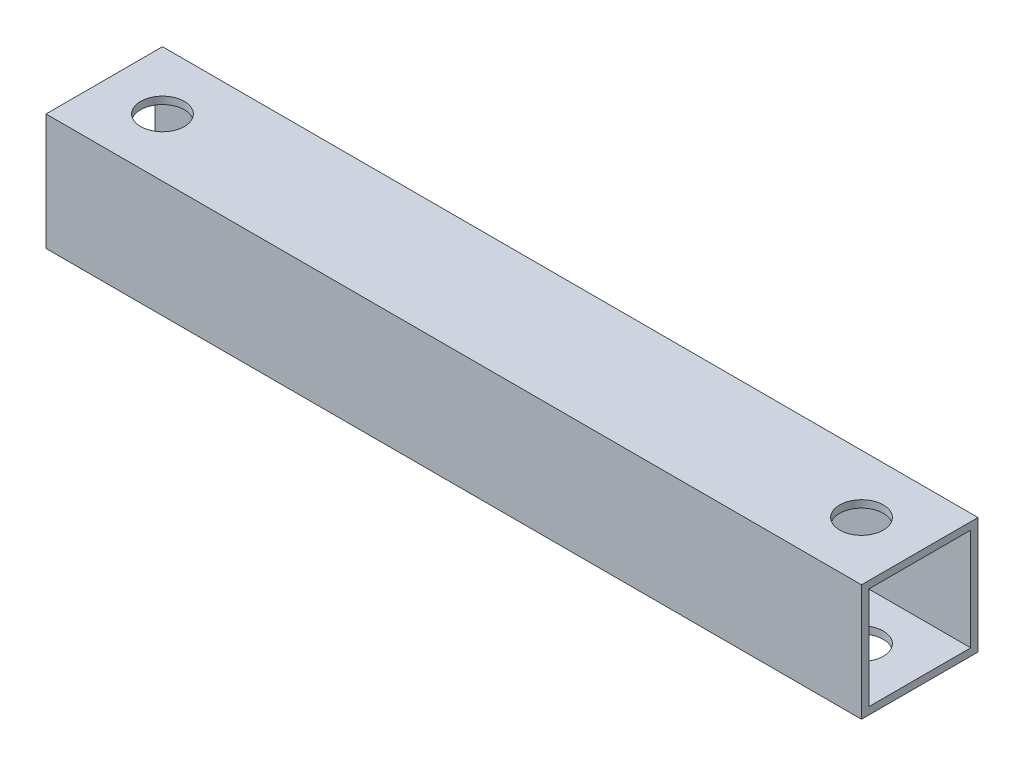
ISO-10303-21;
HEADER;
FILE_DESCRIPTION(('STEP AP214'),'2;1');
FILE_NAME('part.step','',(''),(''),'','','');
FILE_SCHEMA(('AUTOMOTIVE_DESIGN { 1 0 10303 214 1 1 1 1 }'));
ENDSEC;
DATA;
#1=APPLICATION_CONTEXT('core data for automotive mechanical design processes');
#2=APPLICATION_PROTOCOL_DEFINITION('international standard','automotive_design',2000,#1);
#3=PRODUCT_CONTEXT('',#1,'mechanical');
#4=PRODUCT('Part','Part','',(#3));
#5=PRODUCT_RELATED_PRODUCT_CATEGORY('part','',(#4));
#6=PRODUCT_DEFINITION_FORMATION('','',#4);
#7=PRODUCT_DEFINITION_CONTEXT('part definition',#1,'design');
#8=PRODUCT_DEFINITION('design','',#6,#7);
#9=PRODUCT_DEFINITION_SHAPE('','',#8);
#10=(LENGTH_UNIT() NAMED_UNIT(*) SI_UNIT(.MILLI.,.METRE.));
#11=(NAMED_UNIT(*) PLANE_ANGLE_UNIT() SI_UNIT($,.RADIAN.));
#12=(NAMED_UNIT(*) SI_UNIT($,.STERADIAN.) SOLID_ANGLE_UNIT());
#13=UNCERTAINTY_MEASURE_WITH_UNIT(LENGTH_MEASURE(1.E-05),#10,'distance_accuracy_value','');
#14=(GEOMETRIC_REPRESENTATION_CONTEXT(3) GLOBAL_UNCERTAINTY_ASSIGNED_CONTEXT((#13)) GLOBAL_UNIT_ASSIGNED_CONTEXT((#10,
#11,#12)) REPRESENTATION_CONTEXT('',''));
#15=CARTESIAN_POINT('',(0.,0.,0.));
#16=DIRECTION('',(0.,0.,1.));
#17=DIRECTION('',(1.,0.,0.));
#18=AXIS2_PLACEMENT_3D('',#15,#16,#17);
#19=CARTESIAN_POINT('',(177.8,0.,0.));
#20=DIRECTION('',(-1.,0.,0.));
#21=DIRECTION('',(0.,0.,1.));
#22=AXIS2_PLACEMENT_3D('',#19,#20,#21);
#23=PLANE('',#22);
#24=DIRECTION('',(0.,1.,0.));
#25=VECTOR('',#24,1.);
#26=CARTESIAN_POINT('',(177.8,-12.7,-12.7));
#27=LINE('',#26,#25);
#28=CARTESIAN_POINT('',(177.8,-12.7,-12.7));
#29=VERTEX_POINT('',#28);
#30=CARTESIAN_POINT('',(177.8,12.7,-12.7));
#31=VERTEX_POINT('',#30);
#32=EDGE_CURVE('E137',#29,#31,#27,.T.);
#33=ORIENTED_EDGE('',*,*,#32,.T.);
#34=DIRECTION('',(0.,0.,1.));
#35=VECTOR('',#34,1.);
#36=CARTESIAN_POINT('',(177.8,12.7,12.7));
#37=LINE('',#36,#35);
#38=CARTESIAN_POINT('',(177.8,12.7,12.7));
#39=VERTEX_POINT('',#38);
#40=EDGE_CURVE('E140',#31,#39,#37,.T.);
#41=ORIENTED_EDGE('',*,*,#40,.T.);
#42=DIRECTION('',(0.,-1.,0.));
#43=VECTOR('',#42,1.);
#44=CARTESIAN_POINT('',(177.8,-12.7,12.7));
#45=LINE('',#44,#43);
#46=CARTESIAN_POINT('',(177.8,-12.7,12.7));
#47=VERTEX_POINT('',#46);
#48=EDGE_CURVE('E143',#39,#47,#45,.T.);
#49=ORIENTED_EDGE('',*,*,#48,.T.);
#50=DIRECTION('',(0.,0.,-1.));
#51=VECTOR('',#50,1.);
#52=CARTESIAN_POINT('',(177.8,-12.7,12.7));
#53=LINE('',#52,#51);
#54=EDGE_CURVE('E145',#47,#29,#53,.T.);
#55=ORIENTED_EDGE('',*,*,#54,.T.);
#56=EDGE_LOOP('',(#33,#41,#49,#55));
#57=FACE_BOUND('',#56,.T.);
#58=DIRECTION('',(0.,1.,0.));
#59=VECTOR('',#58,1.);
#60=CARTESIAN_POINT('',(177.8,-11.1125,-11.1125));
#61=LINE('',#60,#59);
#62=CARTESIAN_POINT('',(177.8,-11.1125,-11.1125));
#63=VERTEX_POINT('',#62);
#64=CARTESIAN_POINT('',(177.8,11.1125,-11.1125));
#65=VERTEX_POINT('',#64);
#66=EDGE_CURVE('E99',#63,#65,#61,.T.);
#67=ORIENTED_EDGE('',*,*,#66,.F.);
#68=DIRECTION('',(0.,0.,-1.));
#69=VECTOR('',#68,1.);
#70=CARTESIAN_POINT('',(177.8,-11.1125,11.1125));
#71=LINE('',#70,#69);
#72=CARTESIAN_POINT('',(177.8,-11.1125,11.1125));
#73=VERTEX_POINT('',#72);
#74=EDGE_CURVE('E121',#73,#63,#71,.T.);
#75=ORIENTED_EDGE('',*,*,#74,.F.);
#76=DIRECTION('',(0.,-1.,0.));
#77=VECTOR('',#76,1.);
#78=CARTESIAN_POINT('',(177.8,-11.1125,11.1125));
#79=LINE('',#78,#77);
#80=CARTESIAN_POINT('',(177.8,11.1125,11.1125));
#81=VERTEX_POINT('',#80);
#82=EDGE_CURVE('E119',#81,#73,#79,.T.);
#83=ORIENTED_EDGE('',*,*,#82,.F.);
#84=DIRECTION('',(0.,0.,1.));
#85=VECTOR('',#84,1.);
#86=CARTESIAN_POINT('',(177.8,11.1125,11.1125));
#87=LINE('',#86,#85);
#88=EDGE_CURVE('E107',#65,#81,#87,.T.);
#89=ORIENTED_EDGE('',*,*,#88,.F.);
#90=EDGE_LOOP('',(#67,#75,#83,#89));
#91=FACE_BOUND('',#90,.T.);
#92=ADVANCED_FACE('F32',(#57,#91),#23,.F.);
#93=CARTESIAN_POINT('',(0.,0.,0.));
#94=DIRECTION('',(-1.,0.,0.));
#95=DIRECTION('',(0.,0.,1.));
#96=AXIS2_PLACEMENT_3D('',#93,#94,#95);
#97=PLANE('',#96);
#98=DIRECTION('',(0.,1.,0.));
#99=VECTOR('',#98,1.);
#100=CARTESIAN_POINT('',(0.,-12.7,-12.7));
#101=LINE('',#100,#99);
#102=CARTESIAN_POINT('',(0.,-12.7,-12.7));
#103=VERTEX_POINT('',#102);
#104=CARTESIAN_POINT('',(0.,12.7,-12.7));
#105=VERTEX_POINT('',#104);
#106=EDGE_CURVE('E115',#103,#105,#101,.T.);
#107=ORIENTED_EDGE('',*,*,#106,.F.);
#108=DIRECTION('',(0.,0.,-1.));
#109=VECTOR('',#108,1.);
#110=CARTESIAN_POINT('',(0.,-12.7,12.7));
#111=LINE('',#110,#109);
#112=CARTESIAN_POINT('',(0.,-12.7,12.7));
#113=VERTEX_POINT('',#112);
#114=EDGE_CURVE('E141',#113,#103,#111,.T.);
#115=ORIENTED_EDGE('',*,*,#114,.F.);
#116=DIRECTION('',(0.,-1.,0.));
#117=VECTOR('',#116,1.);
#118=CARTESIAN_POINT('',(0.,-12.7,12.7));
#119=LINE('',#118,#117);
#120=CARTESIAN_POINT('',(0.,12.7,12.7));
#121=VERTEX_POINT('',#120);
#122=EDGE_CURVE('E152',#121,#113,#119,.T.);
#123=ORIENTED_EDGE('',*,*,#122,.F.);
#124=DIRECTION('',(0.,0.,1.));
#125=VECTOR('',#124,1.);
#126=CARTESIAN_POINT('',(0.,12.7,12.7));
#127=LINE('',#126,#125);
#128=EDGE_CURVE('E150',#105,#121,#127,.T.);
#129=ORIENTED_EDGE('',*,*,#128,.F.);
#130=EDGE_LOOP('',(#107,#115,#123,#129));
#131=FACE_BOUND('',#130,.T.);
#132=DIRECTION('',(0.,0.,-1.));
#133=VECTOR('',#132,1.);
#134=CARTESIAN_POINT('',(0.,-11.1125,11.1125));
#135=LINE('',#134,#133);
#136=CARTESIAN_POINT('',(0.,-11.1125,11.1125));
#137=VERTEX_POINT('',#136);
#138=CARTESIAN_POINT('',(0.,-11.1125,-11.1125));
#139=VERTEX_POINT('',#138);
#140=EDGE_CURVE('E108',#137,#139,#135,.T.);
#141=ORIENTED_EDGE('',*,*,#140,.T.);
#142=DIRECTION('',(0.,1.,0.));
#143=VECTOR('',#142,1.);
#144=CARTESIAN_POINT('',(0.,-11.1125,-11.1125));
#145=LINE('',#144,#143);
#146=CARTESIAN_POINT('',(0.,11.1125,-11.1125));
#147=VERTEX_POINT('',#146);
#148=EDGE_CURVE('E57',#139,#147,#145,.T.);
#149=ORIENTED_EDGE('',*,*,#148,.T.);
#150=DIRECTION('',(0.,0.,1.));
#151=VECTOR('',#150,1.);
#152=CARTESIAN_POINT('',(0.,11.1125,11.1125));
#153=LINE('',#152,#151);
#154=CARTESIAN_POINT('',(0.,11.1125,11.1125));
#155=VERTEX_POINT('',#154);
#156=EDGE_CURVE('E114',#147,#155,#153,.T.);
#157=ORIENTED_EDGE('',*,*,#156,.T.);
#158=DIRECTION('',(0.,-1.,0.));
#159=VECTOR('',#158,1.);
#160=CARTESIAN_POINT('',(0.,-11.1125,11.1125));
#161=LINE('',#160,#159);
#162=EDGE_CURVE('E129',#155,#137,#161,.T.);
#163=ORIENTED_EDGE('',*,*,#162,.T.);
#164=EDGE_LOOP('',(#141,#149,#157,#163));
#165=FACE_BOUND('',#164,.T.);
#166=ADVANCED_FACE('F199',(#131,#165),#97,.T.);
#167=CARTESIAN_POINT('',(177.8,-12.7,-12.7));
#168=DIRECTION('',(0.,0.,1.));
#169=DIRECTION('',(1.,0.,0.));
#170=AXIS2_PLACEMENT_3D('',#167,#168,#169);
#171=PLANE('',#170);
#172=ORIENTED_EDGE('',*,*,#106,.T.);
#173=DIRECTION('',(-1.,0.,0.));
#174=VECTOR('',#173,1.);
#175=CARTESIAN_POINT('',(177.8,12.7,-12.7));
#176=LINE('',#175,#174);
#177=EDGE_CURVE('E11',#31,#105,#176,.T.);
#178=ORIENTED_EDGE('',*,*,#177,.F.);
#179=ORIENTED_EDGE('',*,*,#32,.F.);
#180=DIRECTION('',(-1.,0.,0.));
#181=VECTOR('',#180,1.);
#182=CARTESIAN_POINT('',(177.8,-12.7,-12.7));
#183=LINE('',#182,#181);
#184=EDGE_CURVE('E147',#29,#103,#183,.T.);
#185=ORIENTED_EDGE('',*,*,#184,.T.);
#186=EDGE_LOOP('',(#172,#178,#179,#185));
#187=FACE_BOUND('',#186,.T.);
#188=ADVANCED_FACE('F34',(#187),#171,.F.);
#189=CARTESIAN_POINT('',(177.8,12.7,12.7));
#190=DIRECTION('',(0.,-1.,0.));
#191=DIRECTION('',(0.,0.,-1.));
#192=AXIS2_PLACEMENT_3D('',#189,#190,#191);
#193=PLANE('',#192);
#194=CARTESIAN_POINT('',(165.1,12.7,0.));
#195=DIRECTION('',(0.,1.,0.));
#196=DIRECTION('',(0.,0.,1.));
#197=AXIS2_PLACEMENT_3D('',#194,#195,#196);
#198=CIRCLE('',#197,4.76250000000001);
#199=CARTESIAN_POINT('',(165.1,12.7,4.76250000000001));
#200=VERTEX_POINT('',#199);
#201=EDGE_CURVE('E178',#200,#200,#198,.T.);
#202=ORIENTED_EDGE('',*,*,#201,.F.);
#203=EDGE_LOOP('',(#202));
#204=FACE_BOUND('',#203,.T.);
#205=CARTESIAN_POINT('',(12.7,12.7,0.));
#206=DIRECTION('',(0.,1.,0.));
#207=DIRECTION('',(0.,0.,1.));
#208=AXIS2_PLACEMENT_3D('',#205,#206,#207);
#209=CIRCLE('',#208,4.7625);
#210=CARTESIAN_POINT('',(12.7,12.7,4.7625));
#211=VERTEX_POINT('',#210);
#212=EDGE_CURVE('E168',#211,#211,#209,.T.);
#213=ORIENTED_EDGE('',*,*,#212,.F.);
#214=EDGE_LOOP('',(#213));
#215=FACE_BOUND('',#214,.T.);
#216=ORIENTED_EDGE('',*,*,#128,.T.);
#217=DIRECTION('',(-1.,0.,0.));
#218=VECTOR('',#217,1.);
#219=CARTESIAN_POINT('',(177.8,12.7,12.7));
#220=LINE('',#219,#218);
#221=EDGE_CURVE('E41',#39,#121,#220,.T.);
#222=ORIENTED_EDGE('',*,*,#221,.F.);
#223=ORIENTED_EDGE('',*,*,#40,.F.);
#224=ORIENTED_EDGE('',*,*,#177,.T.);
#225=EDGE_LOOP('',(#216,#222,#223,#224));
#226=FACE_BOUND('',#225,.T.);
#227=ADVANCED_FACE('F223',(#204,#215,#226),#193,.F.);
#228=CARTESIAN_POINT('',(177.8,-12.7,12.7));
#229=DIRECTION('',(0.,0.,-1.));
#230=DIRECTION('',(-1.,0.,0.));
#231=AXIS2_PLACEMENT_3D('',#228,#229,#230);
#232=PLANE('',#231);
#233=ORIENTED_EDGE('',*,*,#122,.T.);
#234=DIRECTION('',(-1.,0.,0.));
#235=VECTOR('',#234,1.);
#236=CARTESIAN_POINT('',(177.8,-12.7,12.7));
#237=LINE('',#236,#235);
#238=EDGE_CURVE('E157',#47,#113,#237,.T.);
#239=ORIENTED_EDGE('',*,*,#238,.F.);
#240=ORIENTED_EDGE('',*,*,#48,.F.);
#241=ORIENTED_EDGE('',*,*,#221,.T.);
#242=EDGE_LOOP('',(#233,#239,#240,#241));
#243=FACE_BOUND('',#242,.T.);
#244=ADVANCED_FACE('F221',(#243),#232,.F.);
#245=CARTESIAN_POINT('',(177.8,-12.7,12.7));
#246=DIRECTION('',(0.,1.,0.));
#247=DIRECTION('',(0.,0.,1.));
#248=AXIS2_PLACEMENT_3D('',#245,#246,#247);
#249=PLANE('',#248);
#250=CARTESIAN_POINT('',(165.1,-12.7,0.));
#251=DIRECTION('',(0.,1.,0.));
#252=DIRECTION('',(0.,0.,1.));
#253=AXIS2_PLACEMENT_3D('',#250,#251,#252);
#254=CIRCLE('',#253,4.76250000000001);
#255=CARTESIAN_POINT('',(165.1,-12.7,4.76250000000001));
#256=VERTEX_POINT('',#255);
#257=EDGE_CURVE('E181',#256,#256,#254,.T.);
#258=ORIENTED_EDGE('',*,*,#257,.T.);
#259=EDGE_LOOP('',(#258));
#260=FACE_BOUND('',#259,.T.);
#261=CARTESIAN_POINT('',(12.7,-12.7,0.));
#262=DIRECTION('',(0.,1.,0.));
#263=DIRECTION('',(0.,0.,1.));
#264=AXIS2_PLACEMENT_3D('',#261,#262,#263);
#265=CIRCLE('',#264,4.7625);
#266=CARTESIAN_POINT('',(12.7,-12.7,4.7625));
#267=VERTEX_POINT('',#266);
#268=EDGE_CURVE('E163',#267,#267,#265,.T.);
#269=ORIENTED_EDGE('',*,*,#268,.T.);
#270=EDGE_LOOP('',(#269));
#271=FACE_BOUND('',#270,.T.);
#272=ORIENTED_EDGE('',*,*,#114,.T.);
#273=ORIENTED_EDGE('',*,*,#184,.F.);
#274=ORIENTED_EDGE('',*,*,#54,.F.);
#275=ORIENTED_EDGE('',*,*,#238,.T.);
#276=EDGE_LOOP('',(#272,#273,#274,#275));
#277=FACE_BOUND('',#276,.T.);
#278=ADVANCED_FACE('F218',(#260,#271,#277),#249,.F.);
#279=CARTESIAN_POINT('',(177.8,-11.1125,-11.1125));
#280=DIRECTION('',(0.,0.,1.));
#281=DIRECTION('',(1.,0.,0.));
#282=AXIS2_PLACEMENT_3D('',#279,#280,#281);
#283=PLANE('',#282);
#284=ORIENTED_EDGE('',*,*,#148,.F.);
#285=DIRECTION('',(-1.,0.,0.));
#286=VECTOR('',#285,1.);
#287=CARTESIAN_POINT('',(177.8,-11.1125,-11.1125));
#288=LINE('',#287,#286);
#289=EDGE_CURVE('E103',#63,#139,#288,.T.);
#290=ORIENTED_EDGE('',*,*,#289,.F.);
#291=ORIENTED_EDGE('',*,*,#66,.T.);
#292=DIRECTION('',(-1.,0.,0.));
#293=VECTOR('',#292,1.);
#294=CARTESIAN_POINT('',(177.8,11.1125,-11.1125));
#295=LINE('',#294,#293);
#296=EDGE_CURVE('E102',#65,#147,#295,.T.);
#297=ORIENTED_EDGE('',*,*,#296,.T.);
#298=EDGE_LOOP('',(#284,#290,#291,#297));
#299=FACE_BOUND('',#298,.T.);
#300=ADVANCED_FACE('F101',(#299),#283,.T.);
#301=CARTESIAN_POINT('',(177.8,11.1125,11.1125));
#302=DIRECTION('',(0.,-1.,0.));
#303=DIRECTION('',(0.,0.,-1.));
#304=AXIS2_PLACEMENT_3D('',#301,#302,#303);
#305=PLANE('',#304);
#306=CARTESIAN_POINT('',(165.1,11.1125,0.));
#307=DIRECTION('',(0.,-1.,0.));
#308=DIRECTION('',(0.,0.,-1.));
#309=AXIS2_PLACEMENT_3D('',#306,#307,#308);
#310=CIRCLE('',#309,4.76250000000001);
#311=CARTESIAN_POINT('',(165.1,11.1125,-4.76250000000001));
#312=VERTEX_POINT('',#311);
#313=EDGE_CURVE('E173',#312,#312,#310,.T.);
#314=ORIENTED_EDGE('',*,*,#313,.F.);
#315=EDGE_LOOP('',(#314));
#316=FACE_BOUND('',#315,.T.);
#317=CARTESIAN_POINT('',(12.7,11.1125,0.));
#318=DIRECTION('',(0.,-1.,0.));
#319=DIRECTION('',(0.,0.,-1.));
#320=AXIS2_PLACEMENT_3D('',#317,#318,#319);
#321=CIRCLE('',#320,4.7625);
#322=CARTESIAN_POINT('',(12.7,11.1125,-4.7625));
#323=VERTEX_POINT('',#322);
#324=EDGE_CURVE('E127',#323,#323,#321,.T.);
#325=ORIENTED_EDGE('',*,*,#324,.F.);
#326=EDGE_LOOP('',(#325));
#327=FACE_BOUND('',#326,.T.);
#328=ORIENTED_EDGE('',*,*,#156,.F.);
#329=ORIENTED_EDGE('',*,*,#296,.F.);
#330=ORIENTED_EDGE('',*,*,#88,.T.);
#331=DIRECTION('',(-1.,0.,0.));
#332=VECTOR('',#331,1.);
#333=CARTESIAN_POINT('',(177.8,11.1125,11.1125));
#334=LINE('',#333,#332);
#335=EDGE_CURVE('E116',#81,#155,#334,.T.);
#336=ORIENTED_EDGE('',*,*,#335,.T.);
#337=EDGE_LOOP('',(#328,#329,#330,#336));
#338=FACE_BOUND('',#337,.T.);
#339=ADVANCED_FACE('F111',(#316,#327,#338),#305,.T.);
#340=CARTESIAN_POINT('',(177.8,-11.1125,11.1125));
#341=DIRECTION('',(0.,0.,-1.));
#342=DIRECTION('',(-1.,0.,0.));
#343=AXIS2_PLACEMENT_3D('',#340,#341,#342);
#344=PLANE('',#343);
#345=ORIENTED_EDGE('',*,*,#162,.F.);
#346=ORIENTED_EDGE('',*,*,#335,.F.);
#347=ORIENTED_EDGE('',*,*,#82,.T.);
#348=DIRECTION('',(-1.,0.,0.));
#349=VECTOR('',#348,1.);
#350=CARTESIAN_POINT('',(177.8,-11.1125,11.1125));
#351=LINE('',#350,#349);
#352=EDGE_CURVE('E49',#73,#137,#351,.T.);
#353=ORIENTED_EDGE('',*,*,#352,.T.);
#354=EDGE_LOOP('',(#345,#346,#347,#353));
#355=FACE_BOUND('',#354,.T.);
#356=ADVANCED_FACE('F195',(#355),#344,.T.);
#357=CARTESIAN_POINT('',(177.8,-11.1125,11.1125));
#358=DIRECTION('',(0.,1.,0.));
#359=DIRECTION('',(0.,0.,1.));
#360=AXIS2_PLACEMENT_3D('',#357,#358,#359);
#361=PLANE('',#360);
#362=CARTESIAN_POINT('',(165.1,-11.1125,0.));
#363=DIRECTION('',(0.,1.,0.));
#364=DIRECTION('',(0.,0.,1.));
#365=AXIS2_PLACEMENT_3D('',#362,#363,#364);
#366=CIRCLE('',#365,4.76250000000001);
#367=CARTESIAN_POINT('',(165.1,-11.1125,4.76250000000001));
#368=VERTEX_POINT('',#367);
#369=EDGE_CURVE('E36',#368,#368,#366,.T.);
#370=ORIENTED_EDGE('',*,*,#369,.F.);
#371=EDGE_LOOP('',(#370));
#372=FACE_BOUND('',#371,.T.);
#373=CARTESIAN_POINT('',(12.7,-11.1125,0.));
#374=DIRECTION('',(0.,1.,0.));
#375=DIRECTION('',(0.,0.,1.));
#376=AXIS2_PLACEMENT_3D('',#373,#374,#375);
#377=CIRCLE('',#376,4.7625);
#378=CARTESIAN_POINT('',(12.7,-11.1125,4.7625));
#379=VERTEX_POINT('',#378);
#380=EDGE_CURVE('E161',#379,#379,#377,.T.);
#381=ORIENTED_EDGE('',*,*,#380,.F.);
#382=EDGE_LOOP('',(#381));
#383=FACE_BOUND('',#382,.T.);
#384=ORIENTED_EDGE('',*,*,#140,.F.);
#385=ORIENTED_EDGE('',*,*,#352,.F.);
#386=ORIENTED_EDGE('',*,*,#74,.T.);
#387=ORIENTED_EDGE('',*,*,#289,.T.);
#388=EDGE_LOOP('',(#384,#385,#386,#387));
#389=FACE_BOUND('',#388,.T.);
#390=ADVANCED_FACE('F191',(#372,#383,#389),#361,.T.);
#391=CARTESIAN_POINT('',(12.7,-12.7,0.));
#392=DIRECTION('',(0.,1.,0.));
#393=DIRECTION('',(0.,0.,1.));
#394=AXIS2_PLACEMENT_3D('',#391,#392,#393);
#395=CYLINDRICAL_SURFACE('',#394,4.7625);
#396=ORIENTED_EDGE('',*,*,#380,.T.);
#397=EDGE_LOOP('',(#396));
#398=FACE_BOUND('',#397,.T.);
#399=ORIENTED_EDGE('',*,*,#268,.F.);
#400=EDGE_LOOP('',(#399));
#401=FACE_BOUND('',#400,.T.);
#402=ADVANCED_FACE('F194',(#398,#401),#395,.F.);
#403=ORIENTED_EDGE('',*,*,#324,.T.);
#404=EDGE_LOOP('',(#403));
#405=FACE_BOUND('',#404,.T.);
#406=ORIENTED_EDGE('',*,*,#212,.T.);
#407=EDGE_LOOP('',(#406));
#408=FACE_BOUND('',#407,.T.);
#409=ADVANCED_FACE('F247',(#405,#408),#395,.F.);
#410=CARTESIAN_POINT('',(165.1,-12.7,0.));
#411=DIRECTION('',(0.,1.,0.));
#412=DIRECTION('',(0.,0.,1.));
#413=AXIS2_PLACEMENT_3D('',#410,#411,#412);
#414=CYLINDRICAL_SURFACE('',#413,4.76250000000001);
#415=ORIENTED_EDGE('',*,*,#369,.T.);
#416=EDGE_LOOP('',(#415));
#417=FACE_BOUND('',#416,.T.);
#418=ORIENTED_EDGE('',*,*,#257,.F.);
#419=EDGE_LOOP('',(#418));
#420=FACE_BOUND('',#419,.T.);
#421=ADVANCED_FACE('F188',(#417,#420),#414,.F.);
#422=ORIENTED_EDGE('',*,*,#313,.T.);
#423=EDGE_LOOP('',(#422));
#424=FACE_BOUND('',#423,.T.);
#425=ORIENTED_EDGE('',*,*,#201,.T.);
#426=EDGE_LOOP('',(#425));
#427=FACE_BOUND('',#426,.T.);
#428=ADVANCED_FACE('F255',(#424,#427),#414,.F.);
#429=CLOSED_SHELL('',(#92,#166,#188,#227,#244,#278,#300,#339,#356,#390,#402,#409,#421,#428));
#430=MANIFOLD_SOLID_BREP('B2',#429);
#431=ADVANCED_BREP_SHAPE_REPRESENTATION('',(#18,#430),#14);
#432=SHAPE_DEFINITION_REPRESENTATION(#9,#431);
ENDSEC;
END-ISO-10303-21;
